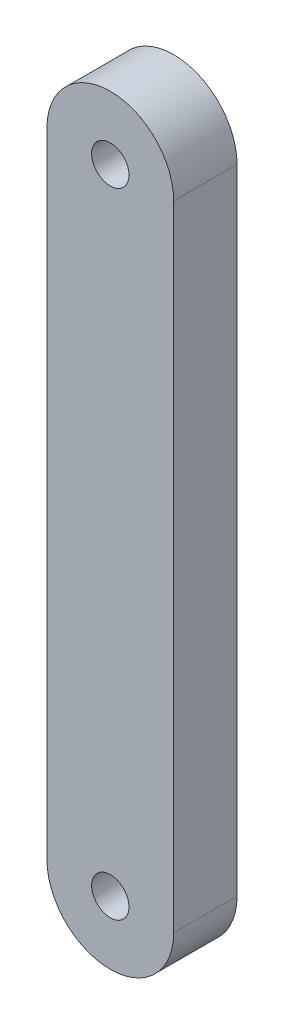
ISO-10303-21;
HEADER;
FILE_DESCRIPTION(('STEP AP214'),'2;1');
FILE_NAME('part.step','',(''),(''),'','','');
FILE_SCHEMA(('AUTOMOTIVE_DESIGN { 1 0 10303 214 1 1 1 1 }'));
ENDSEC;
DATA;
#1=APPLICATION_CONTEXT('core data for automotive mechanical design processes');
#2=APPLICATION_PROTOCOL_DEFINITION('international standard','automotive_design',2000,#1);
#3=PRODUCT_CONTEXT('',#1,'mechanical');
#4=PRODUCT('Part','Part','',(#3));
#5=PRODUCT_RELATED_PRODUCT_CATEGORY('part','',(#4));
#6=PRODUCT_DEFINITION_FORMATION('','',#4);
#7=PRODUCT_DEFINITION_CONTEXT('part definition',#1,'design');
#8=PRODUCT_DEFINITION('design','',#6,#7);
#9=PRODUCT_DEFINITION_SHAPE('','',#8);
#10=(LENGTH_UNIT() NAMED_UNIT(*) SI_UNIT(.MILLI.,.METRE.));
#11=(NAMED_UNIT(*) PLANE_ANGLE_UNIT() SI_UNIT($,.RADIAN.));
#12=(NAMED_UNIT(*) SI_UNIT($,.STERADIAN.) SOLID_ANGLE_UNIT());
#13=UNCERTAINTY_MEASURE_WITH_UNIT(LENGTH_MEASURE(1.E-05),#10,'distance_accuracy_value','');
#14=(GEOMETRIC_REPRESENTATION_CONTEXT(3) GLOBAL_UNCERTAINTY_ASSIGNED_CONTEXT((#13)) GLOBAL_UNIT_ASSIGNED_CONTEXT((#10,
#11,#12)) REPRESENTATION_CONTEXT('',''));
#15=CARTESIAN_POINT('',(0.,0.,0.));
#16=DIRECTION('',(0.,0.,1.));
#17=DIRECTION('',(1.,0.,0.));
#18=AXIS2_PLACEMENT_3D('',#15,#16,#17);
#19=CARTESIAN_POINT('',(0.,25.,5.));
#20=DIRECTION('',(0.,0.,-1.));
#21=DIRECTION('',(-1.,0.,0.));
#22=AXIS2_PLACEMENT_3D('',#19,#20,#21);
#23=CYLINDRICAL_SURFACE('',#22,5.);
#24=CARTESIAN_POINT('',(0.,25.,0.));
#25=DIRECTION('',(0.,0.,1.));
#26=DIRECTION('',(1.,0.,0.));
#27=AXIS2_PLACEMENT_3D('',#24,#25,#26);
#28=CIRCLE('',#27,5.);
#29=CARTESIAN_POINT('',(4.99999999999999,25.,0.));
#30=VERTEX_POINT('',#29);
#31=CARTESIAN_POINT('',(-5.00000000000001,25.,0.));
#32=VERTEX_POINT('',#31);
#33=EDGE_CURVE('E96',#30,#32,#28,.T.);
#34=ORIENTED_EDGE('',*,*,#33,.T.);
#35=DIRECTION('',(0.,0.,-1.));
#36=VECTOR('',#35,1.);
#37=CARTESIAN_POINT('',(-5.00000000000001,25.,5.));
#38=LINE('',#37,#36);
#39=CARTESIAN_POINT('',(-5.00000000000001,25.,5.));
#40=VERTEX_POINT('',#39);
#41=EDGE_CURVE('E11',#40,#32,#38,.T.);
#42=ORIENTED_EDGE('',*,*,#41,.F.);
#43=CARTESIAN_POINT('',(0.,25.,5.));
#44=DIRECTION('',(0.,0.,1.));
#45=DIRECTION('',(1.,0.,0.));
#46=AXIS2_PLACEMENT_3D('',#43,#44,#45);
#47=CIRCLE('',#46,5.);
#48=CARTESIAN_POINT('',(4.99999999999999,25.,5.));
#49=VERTEX_POINT('',#48);
#50=EDGE_CURVE('E84',#49,#40,#47,.T.);
#51=ORIENTED_EDGE('',*,*,#50,.F.);
#52=DIRECTION('',(0.,0.,-1.));
#53=VECTOR('',#52,1.);
#54=CARTESIAN_POINT('',(4.99999999999999,25.,5.));
#55=LINE('',#54,#53);
#56=EDGE_CURVE('E92',#49,#30,#55,.T.);
#57=ORIENTED_EDGE('',*,*,#56,.T.);
#58=EDGE_LOOP('',(#34,#42,#51,#57));
#59=FACE_BOUND('',#58,.T.);
#60=ADVANCED_FACE('F33',(#59),#23,.T.);
#61=CARTESIAN_POINT('',(-5.00000000000001,25.,5.));
#62=DIRECTION('',(1.,0.,0.));
#63=DIRECTION('',(0.,1.,0.));
#64=AXIS2_PLACEMENT_3D('',#61,#62,#63);
#65=PLANE('',#64);
#66=DIRECTION('',(0.,-1.,0.));
#67=VECTOR('',#66,1.);
#68=CARTESIAN_POINT('',(-5.00000000000001,25.,0.));
#69=LINE('',#68,#67);
#70=CARTESIAN_POINT('',(-4.99999999999999,-25.,0.));
#71=VERTEX_POINT('',#70);
#72=EDGE_CURVE('E88',#32,#71,#69,.T.);
#73=ORIENTED_EDGE('',*,*,#72,.T.);
#74=DIRECTION('',(0.,0.,-1.));
#75=VECTOR('',#74,1.);
#76=CARTESIAN_POINT('',(-4.99999999999999,-25.,5.));
#77=LINE('',#76,#75);
#78=CARTESIAN_POINT('',(-4.99999999999999,-25.,5.));
#79=VERTEX_POINT('',#78);
#80=EDGE_CURVE('E41',#79,#71,#77,.T.);
#81=ORIENTED_EDGE('',*,*,#80,.F.);
#82=DIRECTION('',(0.,-1.,0.));
#83=VECTOR('',#82,1.);
#84=CARTESIAN_POINT('',(-5.00000000000001,25.,5.));
#85=LINE('',#84,#83);
#86=EDGE_CURVE('E79',#40,#79,#85,.T.);
#87=ORIENTED_EDGE('',*,*,#86,.F.);
#88=ORIENTED_EDGE('',*,*,#41,.T.);
#89=EDGE_LOOP('',(#73,#81,#87,#88));
#90=FACE_BOUND('',#89,.T.);
#91=ADVANCED_FACE('F87',(#90),#65,.F.);
#92=CARTESIAN_POINT('',(0.,-25.,5.));
#93=DIRECTION('',(0.,0.,-1.));
#94=DIRECTION('',(-1.,0.,0.));
#95=AXIS2_PLACEMENT_3D('',#92,#93,#94);
#96=CYLINDRICAL_SURFACE('',#95,5.);
#97=CARTESIAN_POINT('',(0.,-25.,0.));
#98=DIRECTION('',(0.,0.,1.));
#99=DIRECTION('',(1.,0.,0.));
#100=AXIS2_PLACEMENT_3D('',#97,#98,#99);
#101=CIRCLE('',#100,5.);
#102=CARTESIAN_POINT('',(5.,-25.,0.));
#103=VERTEX_POINT('',#102);
#104=EDGE_CURVE('E66',#71,#103,#101,.T.);
#105=ORIENTED_EDGE('',*,*,#104,.T.);
#106=DIRECTION('',(0.,0.,-1.));
#107=VECTOR('',#106,1.);
#108=CARTESIAN_POINT('',(5.,-25.,5.));
#109=LINE('',#108,#107);
#110=CARTESIAN_POINT('',(5.,-25.,5.));
#111=VERTEX_POINT('',#110);
#112=EDGE_CURVE('E89',#111,#103,#109,.T.);
#113=ORIENTED_EDGE('',*,*,#112,.F.);
#114=CARTESIAN_POINT('',(0.,-25.,5.));
#115=DIRECTION('',(0.,0.,1.));
#116=DIRECTION('',(1.,0.,0.));
#117=AXIS2_PLACEMENT_3D('',#114,#115,#116);
#118=CIRCLE('',#117,5.);
#119=EDGE_CURVE('E82',#79,#111,#118,.T.);
#120=ORIENTED_EDGE('',*,*,#119,.F.);
#121=ORIENTED_EDGE('',*,*,#80,.T.);
#122=EDGE_LOOP('',(#105,#113,#120,#121));
#123=FACE_BOUND('',#122,.T.);
#124=ADVANCED_FACE('F90',(#123),#96,.T.);
#125=CARTESIAN_POINT('',(4.99999999999999,25.,5.));
#126=DIRECTION('',(-1.,0.,0.));
#127=DIRECTION('',(0.,-1.,0.));
#128=AXIS2_PLACEMENT_3D('',#125,#126,#127);
#129=PLANE('',#128);
#130=DIRECTION('',(0.,1.,0.));
#131=VECTOR('',#130,1.);
#132=CARTESIAN_POINT('',(4.99999999999999,25.,0.));
#133=LINE('',#132,#131);
#134=EDGE_CURVE('E72',#103,#30,#133,.T.);
#135=ORIENTED_EDGE('',*,*,#134,.T.);
#136=ORIENTED_EDGE('',*,*,#56,.F.);
#137=DIRECTION('',(0.,1.,0.));
#138=VECTOR('',#137,1.);
#139=CARTESIAN_POINT('',(4.99999999999999,25.,5.));
#140=LINE('',#139,#138);
#141=EDGE_CURVE('E49',#111,#49,#140,.T.);
#142=ORIENTED_EDGE('',*,*,#141,.F.);
#143=ORIENTED_EDGE('',*,*,#112,.T.);
#144=EDGE_LOOP('',(#135,#136,#142,#143));
#145=FACE_BOUND('',#144,.T.);
#146=ADVANCED_FACE('F104',(#145),#129,.F.);
#147=CARTESIAN_POINT('',(0.,25.,5.));
#148=DIRECTION('',(0.,0.,1.));
#149=DIRECTION('',(1.,0.,0.));
#150=AXIS2_PLACEMENT_3D('',#147,#148,#149);
#151=PLANE('',#150);
#152=CARTESIAN_POINT('',(0.,-25.,5.));
#153=DIRECTION('',(0.,0.,1.));
#154=DIRECTION('',(1.,0.,0.));
#155=AXIS2_PLACEMENT_3D('',#152,#153,#154);
#156=CIRCLE('',#155,1.475);
#157=CARTESIAN_POINT('',(1.47500000000001,-25.,5.));
#158=VERTEX_POINT('',#157);
#159=EDGE_CURVE('E99',#158,#158,#156,.T.);
#160=ORIENTED_EDGE('',*,*,#159,.F.);
#161=EDGE_LOOP('',(#160));
#162=FACE_BOUND('',#161,.T.);
#163=CARTESIAN_POINT('',(0.,25.,5.));
#164=DIRECTION('',(0.,0.,1.));
#165=DIRECTION('',(1.,0.,0.));
#166=AXIS2_PLACEMENT_3D('',#163,#164,#165);
#167=CIRCLE('',#166,1.475);
#168=CARTESIAN_POINT('',(1.47499999999999,25.,5.));
#169=VERTEX_POINT('',#168);
#170=EDGE_CURVE('E112',#169,#169,#167,.T.);
#171=ORIENTED_EDGE('',*,*,#170,.F.);
#172=EDGE_LOOP('',(#171));
#173=FACE_BOUND('',#172,.T.);
#174=ORIENTED_EDGE('',*,*,#50,.T.);
#175=ORIENTED_EDGE('',*,*,#86,.T.);
#176=ORIENTED_EDGE('',*,*,#119,.T.);
#177=ORIENTED_EDGE('',*,*,#141,.T.);
#178=EDGE_LOOP('',(#174,#175,#176,#177));
#179=FACE_BOUND('',#178,.T.);
#180=ADVANCED_FACE('F80',(#162,#173,#179),#151,.T.);
#181=CARTESIAN_POINT('',(0.,25.,0.));
#182=DIRECTION('',(0.,0.,1.));
#183=DIRECTION('',(1.,0.,0.));
#184=AXIS2_PLACEMENT_3D('',#181,#182,#183);
#185=PLANE('',#184);
#186=CARTESIAN_POINT('',(0.,-25.,0.));
#187=DIRECTION('',(0.,0.,-1.));
#188=DIRECTION('',(-1.,0.,0.));
#189=AXIS2_PLACEMENT_3D('',#186,#187,#188);
#190=CIRCLE('',#189,1.475);
#191=CARTESIAN_POINT('',(-1.475,-25.,0.));
#192=VERTEX_POINT('',#191);
#193=EDGE_CURVE('E115',#192,#192,#190,.T.);
#194=ORIENTED_EDGE('',*,*,#193,.F.);
#195=EDGE_LOOP('',(#194));
#196=FACE_BOUND('',#195,.T.);
#197=CARTESIAN_POINT('',(0.,25.,0.));
#198=DIRECTION('',(0.,0.,-1.));
#199=DIRECTION('',(-1.,0.,0.));
#200=AXIS2_PLACEMENT_3D('',#197,#198,#199);
#201=CIRCLE('',#200,1.475);
#202=CARTESIAN_POINT('',(-1.47500000000001,25.,0.));
#203=VERTEX_POINT('',#202);
#204=EDGE_CURVE('E116',#203,#203,#201,.T.);
#205=ORIENTED_EDGE('',*,*,#204,.F.);
#206=EDGE_LOOP('',(#205));
#207=FACE_BOUND('',#206,.T.);
#208=ORIENTED_EDGE('',*,*,#33,.F.);
#209=ORIENTED_EDGE('',*,*,#134,.F.);
#210=ORIENTED_EDGE('',*,*,#104,.F.);
#211=ORIENTED_EDGE('',*,*,#72,.F.);
#212=EDGE_LOOP('',(#208,#209,#210,#211));
#213=FACE_BOUND('',#212,.T.);
#214=ADVANCED_FACE('F107',(#196,#207,#213),#185,.F.);
#215=CARTESIAN_POINT('',(0.,25.,10.));
#216=DIRECTION('',(0.,0.,-1.));
#217=DIRECTION('',(-1.,0.,0.));
#218=AXIS2_PLACEMENT_3D('',#215,#216,#217);
#219=CYLINDRICAL_SURFACE('',#218,1.475);
#220=ORIENTED_EDGE('',*,*,#170,.T.);
#221=EDGE_LOOP('',(#220));
#222=FACE_BOUND('',#221,.T.);
#223=ORIENTED_EDGE('',*,*,#204,.T.);
#224=EDGE_LOOP('',(#223));
#225=FACE_BOUND('',#224,.T.);
#226=ADVANCED_FACE('F126',(#222,#225),#219,.F.);
#227=CARTESIAN_POINT('',(0.,-25.,10.));
#228=DIRECTION('',(0.,0.,-1.));
#229=DIRECTION('',(-1.,0.,0.));
#230=AXIS2_PLACEMENT_3D('',#227,#228,#229);
#231=CYLINDRICAL_SURFACE('',#230,1.475);
#232=ORIENTED_EDGE('',*,*,#159,.T.);
#233=EDGE_LOOP('',(#232));
#234=FACE_BOUND('',#233,.T.);
#235=ORIENTED_EDGE('',*,*,#193,.T.);
#236=EDGE_LOOP('',(#235));
#237=FACE_BOUND('',#236,.T.);
#238=ADVANCED_FACE('F122',(#234,#237),#231,.F.);
#239=CLOSED_SHELL('',(#60,#91,#124,#146,#180,#214,#226,#238));
#240=MANIFOLD_SOLID_BREP('B2',#239);
#241=ADVANCED_BREP_SHAPE_REPRESENTATION('',(#18,#240),#14);
#242=SHAPE_DEFINITION_REPRESENTATION(#9,#241);
ENDSEC;
END-ISO-10303-21;
